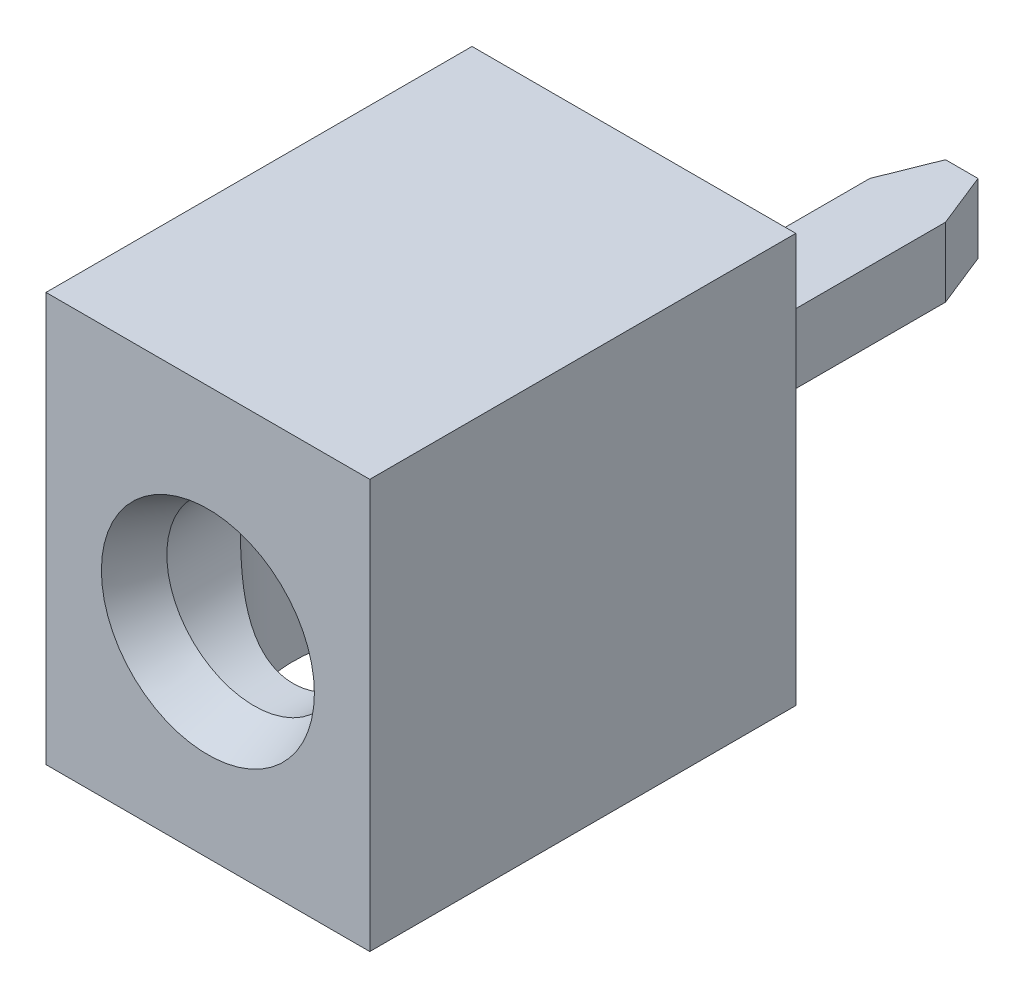
ISO-10303-21;
HEADER;
FILE_DESCRIPTION(('STEP AP214'),'2;1');
FILE_NAME('part.step','',(''),(''),'','','');
FILE_SCHEMA(('AUTOMOTIVE_DESIGN { 1 0 10303 214 1 1 1 1 }'));
ENDSEC;
DATA;
#1=APPLICATION_CONTEXT('core data for automotive mechanical design processes');
#2=APPLICATION_PROTOCOL_DEFINITION('international standard','automotive_design',2000,#1);
#3=PRODUCT_CONTEXT('',#1,'mechanical');
#4=PRODUCT('Part','Part','',(#3));
#5=PRODUCT_RELATED_PRODUCT_CATEGORY('part','',(#4));
#6=PRODUCT_DEFINITION_FORMATION('','',#4);
#7=PRODUCT_DEFINITION_CONTEXT('part definition',#1,'design');
#8=PRODUCT_DEFINITION('design','',#6,#7);
#9=PRODUCT_DEFINITION_SHAPE('','',#8);
#10=(LENGTH_UNIT() NAMED_UNIT(*) SI_UNIT(.MILLI.,.METRE.));
#11=(NAMED_UNIT(*) PLANE_ANGLE_UNIT() SI_UNIT($,.RADIAN.));
#12=(NAMED_UNIT(*) SI_UNIT($,.STERADIAN.) SOLID_ANGLE_UNIT());
#13=UNCERTAINTY_MEASURE_WITH_UNIT(LENGTH_MEASURE(1.E-05),#10,'distance_accuracy_value','');
#14=(GEOMETRIC_REPRESENTATION_CONTEXT(3) GLOBAL_UNCERTAINTY_ASSIGNED_CONTEXT((#13)) GLOBAL_UNIT_ASSIGNED_CONTEXT((#10,
#11,#12)) REPRESENTATION_CONTEXT('',''));
#15=CARTESIAN_POINT('',(0.,0.,0.));
#16=DIRECTION('',(0.,0.,1.));
#17=DIRECTION('',(1.,0.,0.));
#18=AXIS2_PLACEMENT_3D('',#15,#16,#17);
#19=CARTESIAN_POINT('',(-5.5245,-0.4064,0.8));
#20=DIRECTION('',(0.,1.,0.));
#21=DIRECTION('',(0.,0.,1.));
#22=AXIS2_PLACEMENT_3D('',#19,#20,#21);
#23=PLANE('',#22);
#24=DIRECTION('',(1.,0.,0.));
#25=VECTOR('',#24,1.);
#26=CARTESIAN_POINT('',(-5.5245,-0.4064,-3.0479999993));
#27=LINE('',#26,#25);
#28=CARTESIAN_POINT('',(-4.88950000022379,-0.4064,-3.04799999968448));
#29=VERTEX_POINT('',#28);
#30=CARTESIAN_POINT('',(-5.27049999954259,-0.4064,-3.04799999955603));
#31=VERTEX_POINT('',#30);
#32=EDGE_CURVE('E95',#29,#31,#27,.F.);
#33=ORIENTED_EDGE('',*,*,#32,.F.);
#34=DIRECTION('',(-0.371390677284345,0.,-0.928476690513163));
#35=VECTOR('',#34,1.);
#36=CARTESIAN_POINT('',(-4.63549999957,-0.4064,-2.41299999952));
#37=LINE('',#36,#35);
#38=CARTESIAN_POINT('',(-4.63550000011379,-0.4064,-2.41300000058198));
#39=VERTEX_POINT('',#38);
#40=EDGE_CURVE('E101',#39,#29,#37,.T.);
#41=ORIENTED_EDGE('',*,*,#40,.F.);
#42=DIRECTION('',(0.,0.,1.));
#43=VECTOR('',#42,1.);
#44=CARTESIAN_POINT('',(-4.6355,-0.4064,0.8));
#45=LINE('',#44,#43);
#46=CARTESIAN_POINT('',(-4.635500000255,-0.4063999997855,0.8));
#47=VERTEX_POINT('',#46);
#48=EDGE_CURVE('E121',#39,#47,#45,.T.);
#49=ORIENTED_EDGE('',*,*,#48,.T.);
#50=DIRECTION('',(1.,0.,0.));
#51=VECTOR('',#50,1.);
#52=CARTESIAN_POINT('',(-5.5245,-0.4064,0.8));
#53=LINE('',#52,#51);
#54=CARTESIAN_POINT('',(-5.524500000385,-0.4063999993565,0.8));
#55=VERTEX_POINT('',#54);
#56=EDGE_CURVE('E110',#55,#47,#53,.T.);
#57=ORIENTED_EDGE('',*,*,#56,.F.);
#58=DIRECTION('',(0.,0.,-1.));
#59=VECTOR('',#58,1.);
#60=CARTESIAN_POINT('',(-5.5245,-0.406399999142,0.8));
#61=LINE('',#60,#59);
#62=CARTESIAN_POINT('',(-5.52450000004138,-0.4063999997855,-2.41299999953655));
#63=VERTEX_POINT('',#62);
#64=EDGE_CURVE('E157',#55,#63,#61,.T.);
#65=ORIENTED_EDGE('',*,*,#64,.T.);
#66=DIRECTION('',(-0.37139067729695,0.,0.928476690508121));
#67=VECTOR('',#66,1.);
#68=CARTESIAN_POINT('',(-5.27049999934,-0.4064,-3.0479999993));
#69=LINE('',#68,#67);
#70=EDGE_CURVE('E119',#31,#63,#69,.T.);
#71=ORIENTED_EDGE('',*,*,#70,.F.);
#72=EDGE_LOOP('',(#33,#41,#49,#57,#65,#71));
#73=FACE_BOUND('',#72,.T.);
#74=ADVANCED_FACE('F17',(#73),#23,.F.);
#75=CARTESIAN_POINT('',(-5.08,0.127,4.38111140383));
#76=DIRECTION('',(0.,0.,1.));
#77=DIRECTION('',(1.,0.,0.));
#78=AXIS2_PLACEMENT_3D('',#75,#76,#77);
#79=CYLINDRICAL_SURFACE('',#78,1.025);
#80=CARTESIAN_POINT('',(-5.08,0.127,5.25680194789402));
#81=DIRECTION('',(0.,0.,1.));
#82=DIRECTION('',(1.,0.,0.));
#83=AXIS2_PLACEMENT_3D('',#80,#81,#82);
#84=CIRCLE('',#83,1.0249999997787);
#85=CARTESIAN_POINT('',(-4.0550000002213,0.127,5.25680194789402));
#86=VERTEX_POINT('',#85);
#87=EDGE_CURVE('E144',#86,#86,#84,.T.);
#88=ORIENTED_EDGE('',*,*,#87,.T.);
#89=EDGE_LOOP('',(#88));
#90=FACE_BOUND('',#89,.T.);
#91=CARTESIAN_POINT('',(-5.08,1.152,4.8));
#92=CARTESIAN_POINT('',(-5.02875809660387,1.15200218663796,4.80000200455833));
#93=CARTESIAN_POINT('',(-4.97752757876999,1.14813763936166,4.79735295131062));
#94=CARTESIAN_POINT('',(-4.87671120882617,1.13293169384138,4.78702471947178));
#95=CARTESIAN_POINT('',(-4.8271258688621,1.12158798984372,4.77934398966676));
#96=CARTESIAN_POINT('',(-4.73120654644644,1.09213039350657,4.75970281738489));
#97=CARTESIAN_POINT('',(-4.68485840662881,1.07404850085224,4.74776261443114));
#98=CARTESIAN_POINT('',(-4.59605873335621,1.03190002060215,4.72054931528331));
#99=CARTESIAN_POINT('',(-4.55360779354599,1.0078325233075,4.70527571251865));
#100=CARTESIAN_POINT('',(-4.46965007595632,0.952137908514625,4.67102244704643));
#101=CARTESIAN_POINT('',(-4.42854408463548,0.920036354592225,4.65183630077378));
#102=CARTESIAN_POINT('',(-4.35192800707324,0.850341817317325,4.61216496818223));
#103=CARTESIAN_POINT('',(-4.31642609762853,0.812740961264762,4.59167794374893));
#104=CARTESIAN_POINT('',(-4.24596128456147,0.725863854522093,4.54754897159383));
#105=CARTESIAN_POINT('',(-4.21207484084584,0.675686205005853,4.52395042437529));
#106=CARTESIAN_POINT('',(-4.153216576853,0.569031282974823,4.48000903906691));
#107=CARTESIAN_POINT('',(-4.12823251911966,0.512562799358778,4.45966175310859));
#108=CARTESIAN_POINT('',(-4.09432774453257,0.411634145691861,4.43083685779336));
#109=CARTESIAN_POINT('',(-4.08284343130963,0.368532160793004,4.42062833861311));
#110=CARTESIAN_POINT('',(-4.06556515386334,0.280436309248441,4.40501761953886));
#111=CARTESIAN_POINT('',(-4.05975066556042,0.235449885729025,4.39959809081512));
#112=CARTESIAN_POINT('',(-4.05564824669436,0.169161430900103,4.39576549942505));
#113=CARTESIAN_POINT('',(-4.05499660753707,0.148088091008707,4.39515402347627));
#114=CARTESIAN_POINT('',(-4.0550079708613,0.0774533200625722,4.39517339095806));
#115=CARTESIAN_POINT('',(-4.05863184567079,0.0278252110506043,4.39859436278961));
#116=CARTESIAN_POINT('',(-4.07282752097158,-0.0696681290836752,4.4116144120993));
#117=CARTESIAN_POINT('',(-4.08342395323423,-0.117526472790981,4.42123538967884));
#118=CARTESIAN_POINT('',(-4.11068927694933,-0.209670091258928,4.44488228623414));
#119=CARTESIAN_POINT('',(-4.12729097707277,-0.253988523017086,4.4588592367443));
#120=CARTESIAN_POINT('',(-4.16591326125193,-0.339108627995141,4.48956014326405));
#121=CARTESIAN_POINT('',(-4.18793291340652,-0.379910904374533,4.50628362669886));
#122=CARTESIAN_POINT('',(-4.24099472840422,-0.464244998328918,4.54390262065413));
#123=CARTESIAN_POINT('',(-4.27292660412863,-0.507113378117154,4.56503084532318));
#124=CARTESIAN_POINT('',(-4.34310942917977,-0.587469312597153,4.60716185416365));
#125=CARTESIAN_POINT('',(-4.38136752598017,-0.624950690392203,4.6281644682851));
#126=CARTESIAN_POINT('',(-4.47025910255899,-0.69925334487878,4.67150384783364));
#127=CARTESIAN_POINT('',(-4.52189164228672,-0.735071185159344,4.69354255303367));
#128=CARTESIAN_POINT('',(-4.63224208055947,-0.797191134476046,4.73280368733783));
#129=CARTESIAN_POINT('',(-4.69095009928892,-0.823506311819147,4.75003272336114));
#130=CARTESIAN_POINT('',(-4.80429083252096,-0.861744685551522,4.77540537406585));
#131=CARTESIAN_POINT('',(-4.85816144754362,-0.875258977065504,4.78453883098506));
#132=CARTESIAN_POINT('',(-4.96802754141332,-0.893380444479866,4.79683169860646));
#133=CARTESIAN_POINT('',(-5.0240205647924,-0.897997611197969,4.79999781011163));
#134=CARTESIAN_POINT('',(-5.13124190339647,-0.898002186638048,4.80000200455842));
#135=CARTESIAN_POINT('',(-5.18247242123021,-0.894137639361675,4.79735295131063));
#136=CARTESIAN_POINT('',(-5.28328879117387,-0.878931693841328,4.78702471947173));
#137=CARTESIAN_POINT('',(-5.33287413113794,-0.867587989843692,4.77934398966674));
#138=CARTESIAN_POINT('',(-5.42879345355381,-0.838130393506504,4.75970281738485));
#139=CARTESIAN_POINT('',(-5.47514159337163,-0.820048500852071,4.74776261443103));
#140=CARTESIAN_POINT('',(-5.56394126664418,-0.777900020601924,4.72054931528317));
#141=CARTESIAN_POINT('',(-5.60639220645418,-0.753832523307372,4.70527571251857));
#142=CARTESIAN_POINT('',(-5.69034992404314,-0.698137908515003,4.67102244704668));
#143=CARTESIAN_POINT('',(-5.73145591536353,-0.66603635459306,4.65183630077431));
#144=CARTESIAN_POINT('',(-5.80807199292576,-0.596341817318302,4.61216496818273));
#145=CARTESIAN_POINT('',(-5.84357390237075,-0.558740961265282,4.59167794374906));
#146=CARTESIAN_POINT('',(-5.91403871543997,-0.471863854520731,4.5475489715933));
#147=CARTESIAN_POINT('',(-5.94792515915751,-0.421686205002934,4.52395042437454));
#148=CARTESIAN_POINT('',(-6.00678342314711,-0.315031282971513,4.48000903906509));
#149=CARTESIAN_POINT('',(-6.03176748087583,-0.258562799357004,4.45966175310573));
#150=CARTESIAN_POINT('',(-6.06567225546796,-0.157634145701043,4.43083685779765));
#151=CARTESIAN_POINT('',(-6.07715656869692,-0.114532160811997,4.42062833862296));
#152=CARTESIAN_POINT('',(-6.09443484611936,-0.0264363092843876,4.40501761953878));
#153=CARTESIAN_POINT('',(-6.10024933439214,0.0185501142280324,4.39959809079994));
#154=CARTESIAN_POINT('',(-6.10435175333969,0.0848385693140517,4.39576549942085));
#155=CARTESIAN_POINT('',(-6.10500339253363,0.105911909471277,4.39515402348749));
#156=CARTESIAN_POINT('',(-6.10499202920859,0.176546680707779,4.39517339104091));
#157=CARTESIAN_POINT('',(-6.10136815428196,0.226174789739192,4.39859436287364));
#158=CARTESIAN_POINT('',(-6.08717247884024,0.323668129907485,4.4116144122312));
#159=CARTESIAN_POINT('',(-6.07657604655357,0.37152647362917,4.42123538985809));
#160=CARTESIAN_POINT('',(-6.04931072276186,0.463670092115128,4.44488228648942));
#161=CARTESIAN_POINT('',(-6.03270902258635,0.507988523877119,4.4588592370283));
#162=CARTESIAN_POINT('',(-5.99408673830891,0.5931086288541,4.48956014360011));
#163=CARTESIAN_POINT('',(-5.97206708610847,0.633910905228818,4.50628362705808));
#164=CARTESIAN_POINT('',(-5.91900527099797,0.718244999181826,4.54390262106008));
#165=CARTESIAN_POINT('',(-5.88707339520375,0.761113378970849,4.56503084575163));
#166=CARTESIAN_POINT('',(-5.81689057000441,0.841469313441826,4.60716185462564));
#167=CARTESIAN_POINT('',(-5.77863247312538,0.878950691226857,4.62816446875814));
#168=CARTESIAN_POINT('',(-5.68974089640902,0.953253345640972,4.67150384829416));
#169=CARTESIAN_POINT('',(-5.63810835662781,0.989071185863044,4.69354255346999));
#170=CARTESIAN_POINT('',(-5.52775791825749,1.05119113504977,4.73280368770884));
#171=CARTESIAN_POINT('',(-5.46904989948424,1.07750631232179,4.75003272369124));
#172=CARTESIAN_POINT('',(-5.35570916639708,1.11574468584145,4.77540537426109));
#173=CARTESIAN_POINT('',(-5.30183855157611,1.12925897724783,4.78453883110839));
#174=CARTESIAN_POINT('',(-5.19197245813458,1.14738044451743,4.79683169863231));
#175=CARTESIAN_POINT('',(-5.13597943498189,1.15199761119808,4.79999781011174));
#176=CARTESIAN_POINT('',(-5.08,1.152,4.8));
#177=B_SPLINE_CURVE_WITH_KNOTS('',3,(#91,#92,#93,#94,#95,#96,#97,#98,#99,#100,#101,#102,#103,
#104,#105,#106,#107,#108,#109,#110,#111,#112,#113,#114,#115,#116,#117,#118,#119,#120,#121,#122,
#123,#124,#125,#126,#127,#128,#129,#130,#131,#132,#133,#134,#135,#136,#137,#138,#139,#140,#141,
#142,#143,#144,#145,#146,#147,#148,#149,#150,#151,#152,#153,#154,#155,#156,#157,#158,#159,#160,
#161,#162,#163,#164,#165,#166,#167,#168,#169,#170,#171,#172,#173,#174,#175,#176),.UNSPECIFIED.,
.T.,.F.,(4,2,2,2,2,2,2,2,2,2,2,2,2,2,2,2,2,2,2,2,2,2,2,2,2,2,2,2,2,2,2,2,2,2,2,2,2,2,2,2,2,2,4),
(0.,0.153500918855325,0.307049182741793,0.459877350273038,0.612728759009499,0.778829229402619,
0.945169856916163,1.13924012538037,1.33304258107341,1.46979659833109,1.6060537243528,
1.66928199421822,1.81783744424573,1.96692053019654,2.11438469959819,2.26182352250775,
2.43363050027816,2.60563293170866,2.80430457228047,3.00270194452341,3.17058330444543,
3.33827603581985,3.49177695467536,3.64532521856165,3.79815338609361,3.95100479482935,
4.11710526522032,4.28344589273602,4.47751616120587,4.67131861689327,4.80807263412099,
4.94432976012255,5.00755803078391,5.15611348088936,5.30519656693049,5.45266073641646,
5.60009955940064,5.7719065373122,5.94390896889021,6.14258060946665,6.3409779817063,
6.50885934094821,6.67655207164741),.UNSPECIFIED.);
#178=CARTESIAN_POINT('',(-5.08,1.152,4.8));
#179=VERTEX_POINT('',#178);
#180=EDGE_CURVE('E20',#179,#179,#177,.T.);
#181=ORIENTED_EDGE('',*,*,#180,.T.);
#182=EDGE_LOOP('',(#181));
#183=FACE_BOUND('',#182,.T.);
#184=ADVANCED_FACE('F268',(#90,#183),#79,.F.);
#185=CARTESIAN_POINT('',(-5.08,2.327,3.3));
#186=DIRECTION('',(0.,1.,0.));
#187=DIRECTION('',(0.,0.,1.));
#188=AXIS2_PLACEMENT_3D('',#185,#186,#187);
#189=PLANE('',#188);
#190=CARTESIAN_POINT('',(-5.08,2.327,3.3));
#191=DIRECTION('',(0.,-1.,0.));
#192=DIRECTION('',(0.,0.,-1.));
#193=AXIS2_PLACEMENT_3D('',#190,#191,#192);
#194=CIRCLE('',#193,1.5);
#195=CARTESIAN_POINT('',(-5.08,2.327,1.8));
#196=VERTEX_POINT('',#195);
#197=EDGE_CURVE('E135',#196,#196,#194,.T.);
#198=ORIENTED_EDGE('',*,*,#197,.T.);
#199=EDGE_LOOP('',(#198));
#200=FACE_BOUND('',#199,.T.);
#201=ADVANCED_FACE('F265',(#200),#189,.F.);
#202=CARTESIAN_POINT('',(-4.6355,-0.4064,0.8));
#203=DIRECTION('',(-1.,0.,0.));
#204=DIRECTION('',(0.,0.,1.));
#205=AXIS2_PLACEMENT_3D('',#202,#203,#204);
#206=PLANE('',#205);
#207=DIRECTION('',(0.,0.,-1.));
#208=VECTOR('',#207,1.);
#209=CARTESIAN_POINT('',(-4.6355,0.4064,0.8));
#210=LINE('',#209,#208);
#211=CARTESIAN_POINT('',(-4.63549999994379,0.406400000047,-2.41299999985948));
#212=VERTEX_POINT('',#211);
#213=CARTESIAN_POINT('',(-4.635500000085,0.40640000026175,0.8));
#214=VERTEX_POINT('',#213);
#215=EDGE_CURVE('E137',#212,#214,#210,.F.);
#216=ORIENTED_EDGE('',*,*,#215,.T.);
#217=DIRECTION('',(0.,1.,0.));
#218=VECTOR('',#217,1.);
#219=CARTESIAN_POINT('',(-4.6355,-0.4064,0.8));
#220=LINE('',#219,#218);
#221=EDGE_CURVE('E153',#47,#214,#220,.T.);
#222=ORIENTED_EDGE('',*,*,#221,.F.);
#223=ORIENTED_EDGE('',*,*,#48,.F.);
#224=DIRECTION('',(0.,1.,0.));
#225=VECTOR('',#224,1.);
#226=CARTESIAN_POINT('',(-4.63549999977517,-0.4064,-2.41299999943793));
#227=LINE('',#226,#225);
#228=EDGE_CURVE('E106',#39,#212,#227,.T.);
#229=ORIENTED_EDGE('',*,*,#228,.T.);
#230=EDGE_LOOP('',(#216,#222,#223,#229));
#231=FACE_BOUND('',#230,.T.);
#232=ADVANCED_FACE('F261',(#231),#206,.F.);
#233=CARTESIAN_POINT('',(-5.5245,0.4064,0.8));
#234=DIRECTION('',(1.,0.,0.));
#235=DIRECTION('',(0.,0.,-1.));
#236=AXIS2_PLACEMENT_3D('',#233,#234,#235);
#237=PLANE('',#236);
#238=ORIENTED_EDGE('',*,*,#64,.F.);
#239=DIRECTION('',(0.,1.,0.));
#240=VECTOR('',#239,1.);
#241=CARTESIAN_POINT('',(-5.5245,0.4064,0.8));
#242=LINE('',#241,#240);
#243=CARTESIAN_POINT('',(-5.524500000385,0.40640000008725,0.8));
#244=VERTEX_POINT('',#243);
#245=EDGE_CURVE('E155',#244,#55,#242,.F.);
#246=ORIENTED_EDGE('',*,*,#245,.F.);
#247=DIRECTION('',(0.,0.,-1.));
#248=VECTOR('',#247,1.);
#249=CARTESIAN_POINT('',(-5.52450000077,0.4064,0.8));
#250=LINE('',#249,#248);
#251=CARTESIAN_POINT('',(-5.52450000023388,0.4063999998725,-2.4129999990553));
#252=VERTEX_POINT('',#251);
#253=EDGE_CURVE('E141',#244,#252,#250,.T.);
#254=ORIENTED_EDGE('',*,*,#253,.T.);
#255=DIRECTION('',(0.,1.,0.));
#256=VECTOR('',#255,1.);
#257=CARTESIAN_POINT('',(-5.52450000016552,-0.4064,-2.41299999958621));
#258=LINE('',#257,#256);
#259=EDGE_CURVE('E159',#252,#63,#258,.F.);
#260=ORIENTED_EDGE('',*,*,#259,.T.);
#261=EDGE_LOOP('',(#238,#246,#254,#260));
#262=FACE_BOUND('',#261,.T.);
#263=ADVANCED_FACE('F257',(#262),#237,.F.);
#264=CARTESIAN_POINT('',(-5.2705,-0.4064,-3.048));
#265=DIRECTION('',(0.928476690885259,0.,0.371390676354104));
#266=DIRECTION('',(0.371390676354104,0.,-0.928476690885259));
#267=AXIS2_PLACEMENT_3D('',#264,#265,#266);
#268=PLANE('',#267);
#269=DIRECTION('',(0.37139067611209,0.,-0.928476690982065));
#270=VECTOR('',#269,1.);
#271=CARTESIAN_POINT('',(-5.5245,0.4064,-2.41299999952));
#272=LINE('',#271,#270);
#273=CARTESIAN_POINT('',(-5.27049999991017,0.4063999996175,-3.04799999981207));
#274=VERTEX_POINT('',#273);
#275=EDGE_CURVE('E164',#252,#274,#272,.T.);
#276=ORIENTED_EDGE('',*,*,#275,.T.);
#277=DIRECTION('',(0.,1.,0.));
#278=VECTOR('',#277,1.);
#279=CARTESIAN_POINT('',(-5.27049999934,-0.381,-3.048));
#280=LINE('',#279,#278);
#281=EDGE_CURVE('E115',#31,#274,#280,.T.);
#282=ORIENTED_EDGE('',*,*,#281,.F.);
#283=ORIENTED_EDGE('',*,*,#70,.T.);
#284=ORIENTED_EDGE('',*,*,#259,.F.);
#285=EDGE_LOOP('',(#276,#282,#283,#284));
#286=FACE_BOUND('',#285,.T.);
#287=ADVANCED_FACE('F254',(#286),#268,.F.);
#288=CARTESIAN_POINT('',(-7.62,-0.381,-3.048));
#289=DIRECTION('',(0.,0.,-1.));
#290=DIRECTION('',(0.,1.,0.));
#291=AXIS2_PLACEMENT_3D('',#288,#289,#290);
#292=PLANE('',#291);
#293=DIRECTION('',(1.,0.,0.));
#294=VECTOR('',#293,1.);
#295=CARTESIAN_POINT('',(-4.6355,0.4064,-3.048));
#296=LINE('',#295,#294);
#297=CARTESIAN_POINT('',(-4.88950000031379,0.4063999996175,-3.04800000003448));
#298=VERTEX_POINT('',#297);
#299=EDGE_CURVE('E114',#274,#298,#296,.T.);
#300=ORIENTED_EDGE('',*,*,#299,.T.);
#301=DIRECTION('',(0.,1.,0.));
#302=VECTOR('',#301,1.);
#303=CARTESIAN_POINT('',(-4.88950000005517,-0.4064,-3.04800000013793));
#304=LINE('',#303,#302);
#305=EDGE_CURVE('E104',#298,#29,#304,.F.);
#306=ORIENTED_EDGE('',*,*,#305,.T.);
#307=ORIENTED_EDGE('',*,*,#32,.T.);
#308=ORIENTED_EDGE('',*,*,#281,.T.);
#309=EDGE_LOOP('',(#300,#306,#307,#308));
#310=FACE_BOUND('',#309,.T.);
#311=ADVANCED_FACE('F112',(#310),#292,.T.);
#312=CARTESIAN_POINT('',(-4.6355,-0.4064,-2.413));
#313=DIRECTION('',(-0.928476690885259,0.,0.371390676354104));
#314=DIRECTION('',(0.371390676354104,0.,0.928476690885259));
#315=AXIS2_PLACEMENT_3D('',#312,#313,#314);
#316=PLANE('',#315);
#317=ORIENTED_EDGE('',*,*,#40,.T.);
#318=ORIENTED_EDGE('',*,*,#305,.F.);
#319=DIRECTION('',(0.371390676858299,0.,0.928476690683581));
#320=VECTOR('',#319,1.);
#321=CARTESIAN_POINT('',(-4.8895000004,0.4064,-3.048));
#322=LINE('',#321,#320);
#323=EDGE_CURVE('E167',#298,#212,#322,.T.);
#324=ORIENTED_EDGE('',*,*,#323,.T.);
#325=ORIENTED_EDGE('',*,*,#228,.F.);
#326=EDGE_LOOP('',(#317,#318,#324,#325));
#327=FACE_BOUND('',#326,.T.);
#328=ADVANCED_FACE('F102',(#327),#316,.F.);
#329=CARTESIAN_POINT('',(-5.08,0.127,5.80000000002201));
#330=DIRECTION('',(0.,0.,1.));
#331=DIRECTION('',(1.,0.,0.));
#332=AXIS2_PLACEMENT_3D('',#329,#330,#331);
#333=CONICAL_SURFACE('',#332,1.25000000003486,0.392699081714591);
#334=ORIENTED_EDGE('',*,*,#87,.F.);
#335=EDGE_LOOP('',(#334));
#336=FACE_BOUND('',#335,.T.);
#337=CARTESIAN_POINT('',(-5.08,0.127,5.80000000002201));
#338=DIRECTION('',(0.,0.,1.));
#339=DIRECTION('',(1.,0.,0.));
#340=AXIS2_PLACEMENT_3D('',#337,#338,#339);
#341=CIRCLE('',#340,1.25000000003486);
#342=CARTESIAN_POINT('',(-3.82999999996514,0.127,5.80000000002201));
#343=VERTEX_POINT('',#342);
#344=EDGE_CURVE('E131',#343,#343,#341,.F.);
#345=ORIENTED_EDGE('',*,*,#344,.F.);
#346=EDGE_LOOP('',(#345));
#347=FACE_BOUND('',#346,.T.);
#348=ADVANCED_FACE('F239',(#336,#347),#333,.F.);
#349=CARTESIAN_POINT('',(-5.08,2.327,3.3));
#350=DIRECTION('',(0.,-1.,0.));
#351=DIRECTION('',(0.,0.,-1.));
#352=AXIS2_PLACEMENT_3D('',#349,#350,#351);
#353=CYLINDRICAL_SURFACE('',#352,1.5);
#354=CARTESIAN_POINT('',(-5.08,-2.173,3.3));
#355=DIRECTION('',(0.,-1.,0.));
#356=DIRECTION('',(0.,0.,-1.));
#357=AXIS2_PLACEMENT_3D('',#354,#355,#356);
#358=CIRCLE('',#357,1.5);
#359=CARTESIAN_POINT('',(-5.08,-2.173,1.8));
#360=VERTEX_POINT('',#359);
#361=EDGE_CURVE('E126',#360,#360,#358,.F.);
#362=ORIENTED_EDGE('',*,*,#361,.F.);
#363=EDGE_LOOP('',(#362));
#364=FACE_BOUND('',#363,.T.);
#365=ORIENTED_EDGE('',*,*,#197,.F.);
#366=EDGE_LOOP('',(#365));
#367=FACE_BOUND('',#366,.T.);
#368=ORIENTED_EDGE('',*,*,#180,.F.);
#369=EDGE_LOOP('',(#368));
#370=FACE_BOUND('',#369,.T.);
#371=ADVANCED_FACE('F236',(#364,#367,#370),#353,.F.);
#372=CARTESIAN_POINT('',(-6.98,2.627,5.8));
#373=DIRECTION('',(-1.,0.,0.));
#374=DIRECTION('',(0.,0.,1.));
#375=AXIS2_PLACEMENT_3D('',#372,#373,#374);
#376=PLANE('',#375);
#377=DIRECTION('',(0.,0.,-1.));
#378=VECTOR('',#377,1.);
#379=CARTESIAN_POINT('',(-6.98,-2.173,0.8));
#380=LINE('',#379,#378);
#381=CARTESIAN_POINT('',(-6.980000000375,-2.173,5.8));
#382=VERTEX_POINT('',#381);
#383=CARTESIAN_POINT('',(-6.98,-2.173,0.8));
#384=VERTEX_POINT('',#383);
#385=EDGE_CURVE('E130',#382,#384,#380,.T.);
#386=ORIENTED_EDGE('',*,*,#385,.F.);
#387=DIRECTION('',(0.,1.,0.));
#388=VECTOR('',#387,1.);
#389=CARTESIAN_POINT('',(-6.98000000075,2.627,5.8));
#390=LINE('',#389,#388);
#391=CARTESIAN_POINT('',(-6.9800000005625,2.627,5.8));
#392=VERTEX_POINT('',#391);
#393=EDGE_CURVE('E134',#392,#382,#390,.F.);
#394=ORIENTED_EDGE('',*,*,#393,.F.);
#395=DIRECTION('',(0.,0.,-1.));
#396=VECTOR('',#395,1.);
#397=CARTESIAN_POINT('',(-6.98000000075,2.627,0.8));
#398=LINE('',#397,#396);
#399=CARTESIAN_POINT('',(-6.980000000375,2.627,0.8));
#400=VERTEX_POINT('',#399);
#401=EDGE_CURVE('E169',#392,#400,#398,.T.);
#402=ORIENTED_EDGE('',*,*,#401,.T.);
#403=DIRECTION('',(0.,1.,0.));
#404=VECTOR('',#403,1.);
#405=CARTESIAN_POINT('',(-6.98,2.627,0.8));
#406=LINE('',#405,#404);
#407=EDGE_CURVE('E181',#384,#400,#406,.T.);
#408=ORIENTED_EDGE('',*,*,#407,.F.);
#409=EDGE_LOOP('',(#386,#394,#402,#408));
#410=FACE_BOUND('',#409,.T.);
#411=ADVANCED_FACE('F204',(#410),#376,.T.);
#412=CARTESIAN_POINT('',(-4.6355,0.4064,0.8));
#413=DIRECTION('',(0.,-1.,0.));
#414=DIRECTION('',(0.,0.,-1.));
#415=AXIS2_PLACEMENT_3D('',#412,#413,#414);
#416=PLANE('',#415);
#417=ORIENTED_EDGE('',*,*,#299,.F.);
#418=ORIENTED_EDGE('',*,*,#275,.F.);
#419=ORIENTED_EDGE('',*,*,#253,.F.);
#420=DIRECTION('',(-1.,0.,0.));
#421=VECTOR('',#420,1.);
#422=CARTESIAN_POINT('',(-6.98,0.406400000349,0.8));
#423=LINE('',#422,#421);
#424=EDGE_CURVE('E184',#214,#244,#423,.T.);
#425=ORIENTED_EDGE('',*,*,#424,.F.);
#426=ORIENTED_EDGE('',*,*,#215,.F.);
#427=ORIENTED_EDGE('',*,*,#323,.F.);
#428=EDGE_LOOP('',(#417,#418,#419,#425,#426,#427));
#429=FACE_BOUND('',#428,.T.);
#430=ADVANCED_FACE('F211',(#429),#416,.F.);
#431=CARTESIAN_POINT('',(-6.98,2.627,0.8));
#432=DIRECTION('',(0.,-1.,0.));
#433=DIRECTION('',(0.,0.,-1.));
#434=AXIS2_PLACEMENT_3D('',#431,#432,#433);
#435=PLANE('',#434);
#436=DIRECTION('',(0.,0.,-1.));
#437=VECTOR('',#436,1.);
#438=CARTESIAN_POINT('',(-3.18,2.627,0.8));
#439=LINE('',#438,#437);
#440=CARTESIAN_POINT('',(-3.18,2.627,0.8));
#441=VERTEX_POINT('',#440);
#442=CARTESIAN_POINT('',(-3.1799999998125,2.627,5.8));
#443=VERTEX_POINT('',#442);
#444=EDGE_CURVE('E187',#441,#443,#439,.F.);
#445=ORIENTED_EDGE('',*,*,#444,.F.);
#446=DIRECTION('',(-1.,0.,0.));
#447=VECTOR('',#446,1.);
#448=CARTESIAN_POINT('',(-6.98,2.627,0.8));
#449=LINE('',#448,#447);
#450=EDGE_CURVE('E129',#400,#441,#449,.F.);
#451=ORIENTED_EDGE('',*,*,#450,.F.);
#452=ORIENTED_EDGE('',*,*,#401,.F.);
#453=DIRECTION('',(1.,0.,0.));
#454=VECTOR('',#453,1.);
#455=CARTESIAN_POINT('',(-3.18,2.627,5.8));
#456=LINE('',#455,#454);
#457=EDGE_CURVE('E171',#443,#392,#456,.F.);
#458=ORIENTED_EDGE('',*,*,#457,.F.);
#459=EDGE_LOOP('',(#445,#451,#452,#458));
#460=FACE_BOUND('',#459,.T.);
#461=ADVANCED_FACE('F209',(#460),#435,.F.);
#462=CARTESIAN_POINT('',(-3.18,2.627,5.8));
#463=DIRECTION('',(0.,0.,1.));
#464=DIRECTION('',(1.,0.,0.));
#465=AXIS2_PLACEMENT_3D('',#462,#463,#464);
#466=PLANE('',#465);
#467=ORIENTED_EDGE('',*,*,#344,.T.);
#468=EDGE_LOOP('',(#467));
#469=FACE_BOUND('',#468,.T.);
#470=DIRECTION('',(1.,0.,0.));
#471=VECTOR('',#470,1.);
#472=CARTESIAN_POINT('',(-6.98,-2.173,5.8));
#473=LINE('',#472,#471);
#474=CARTESIAN_POINT('',(-3.1799999994375,-2.173,5.8));
#475=VERTEX_POINT('',#474);
#476=EDGE_CURVE('E133',#475,#382,#473,.F.);
#477=ORIENTED_EDGE('',*,*,#476,.F.);
#478=DIRECTION('',(0.,1.,0.));
#479=VECTOR('',#478,1.);
#480=CARTESIAN_POINT('',(-3.18,2.627,5.8));
#481=LINE('',#480,#479);
#482=EDGE_CURVE('E190',#443,#475,#481,.F.);
#483=ORIENTED_EDGE('',*,*,#482,.F.);
#484=ORIENTED_EDGE('',*,*,#457,.T.);
#485=ORIENTED_EDGE('',*,*,#393,.T.);
#486=EDGE_LOOP('',(#477,#483,#484,#485));
#487=FACE_BOUND('',#486,.T.);
#488=ADVANCED_FACE('F201',(#469,#487),#466,.T.);
#489=CARTESIAN_POINT('',(-6.98,-2.173,0.8));
#490=DIRECTION('',(0.,-1.,0.));
#491=DIRECTION('',(0.,0.,-1.));
#492=AXIS2_PLACEMENT_3D('',#489,#490,#491);
#493=PLANE('',#492);
#494=ORIENTED_EDGE('',*,*,#361,.T.);
#495=EDGE_LOOP('',(#494));
#496=FACE_BOUND('',#495,.T.);
#497=ORIENTED_EDGE('',*,*,#385,.T.);
#498=DIRECTION('',(-1.,0.,0.));
#499=VECTOR('',#498,1.);
#500=CARTESIAN_POINT('',(-6.98,-2.173,0.8));
#501=LINE('',#500,#499);
#502=CARTESIAN_POINT('',(-3.179999999625,-2.173,0.8));
#503=VERTEX_POINT('',#502);
#504=EDGE_CURVE('E38',#503,#384,#501,.T.);
#505=ORIENTED_EDGE('',*,*,#504,.F.);
#506=DIRECTION('',(0.,0.,-1.));
#507=VECTOR('',#506,1.);
#508=CARTESIAN_POINT('',(-3.18,-2.173,0.8));
#509=LINE('',#508,#507);
#510=EDGE_CURVE('E29',#475,#503,#509,.T.);
#511=ORIENTED_EDGE('',*,*,#510,.F.);
#512=ORIENTED_EDGE('',*,*,#476,.T.);
#513=EDGE_LOOP('',(#497,#505,#511,#512));
#514=FACE_BOUND('',#513,.T.);
#515=ADVANCED_FACE('F197',(#496,#514),#493,.T.);
#516=CARTESIAN_POINT('',(-6.98,2.627,0.8));
#517=DIRECTION('',(0.,0.,-1.));
#518=DIRECTION('',(-1.,0.,0.));
#519=AXIS2_PLACEMENT_3D('',#516,#517,#518);
#520=PLANE('',#519);
#521=ORIENTED_EDGE('',*,*,#221,.T.);
#522=ORIENTED_EDGE('',*,*,#424,.T.);
#523=ORIENTED_EDGE('',*,*,#245,.T.);
#524=ORIENTED_EDGE('',*,*,#56,.T.);
#525=EDGE_LOOP('',(#521,#522,#523,#524));
#526=FACE_BOUND('',#525,.T.);
#527=ORIENTED_EDGE('',*,*,#504,.T.);
#528=ORIENTED_EDGE('',*,*,#407,.T.);
#529=ORIENTED_EDGE('',*,*,#450,.T.);
#530=DIRECTION('',(0.,1.,0.));
#531=VECTOR('',#530,1.);
#532=CARTESIAN_POINT('',(-3.18,2.627,0.8));
#533=LINE('',#532,#531);
#534=EDGE_CURVE('E11',#503,#441,#533,.T.);
#535=ORIENTED_EDGE('',*,*,#534,.F.);
#536=EDGE_LOOP('',(#527,#528,#529,#535));
#537=FACE_BOUND('',#536,.T.);
#538=ADVANCED_FACE('F207',(#526,#537),#520,.T.);
#539=CARTESIAN_POINT('',(-3.18,2.627,0.8));
#540=DIRECTION('',(1.,0.,0.));
#541=DIRECTION('',(0.,0.,-1.));
#542=AXIS2_PLACEMENT_3D('',#539,#540,#541);
#543=PLANE('',#542);
#544=ORIENTED_EDGE('',*,*,#510,.T.);
#545=ORIENTED_EDGE('',*,*,#534,.T.);
#546=ORIENTED_EDGE('',*,*,#444,.T.);
#547=ORIENTED_EDGE('',*,*,#482,.T.);
#548=EDGE_LOOP('',(#544,#545,#546,#547));
#549=FACE_BOUND('',#548,.T.);
#550=ADVANCED_FACE('F195',(#549),#543,.T.);
#551=CLOSED_SHELL('',(#74,#184,#201,#232,#263,#287,#311,#328,#348,#371,#411,#430,#461,#488,#515,
#538,#550));
#552=MANIFOLD_SOLID_BREP('B1',#551);
#553=ADVANCED_BREP_SHAPE_REPRESENTATION('',(#18,#552),#14);
#554=SHAPE_DEFINITION_REPRESENTATION(#9,#553);
ENDSEC;
END-ISO-10303-21;
